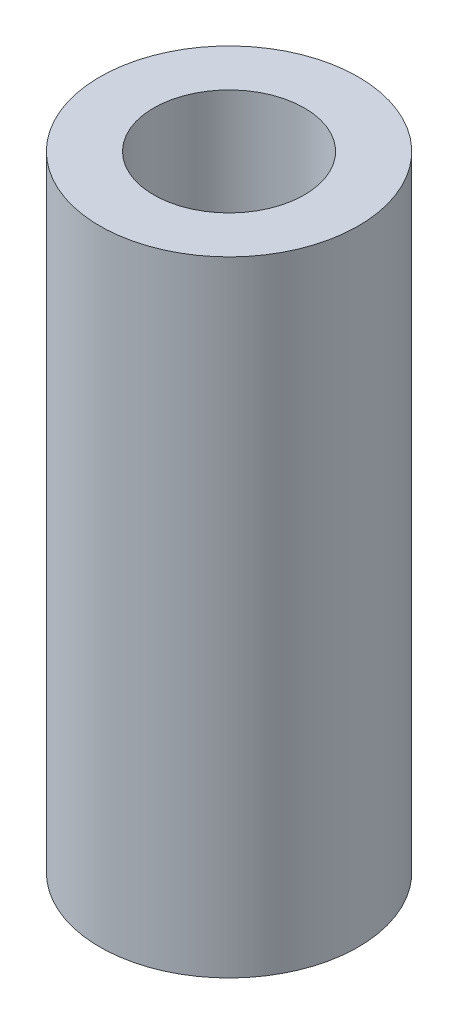
ISO-10303-21;
HEADER;
FILE_DESCRIPTION(('STEP AP214'),'2;1');
FILE_NAME('part.step','',(''),(''),'','','');
FILE_SCHEMA(('AUTOMOTIVE_DESIGN { 1 0 10303 214 1 1 1 1 }'));
ENDSEC;
DATA;
#1=APPLICATION_CONTEXT('core data for automotive mechanical design processes');
#2=APPLICATION_PROTOCOL_DEFINITION('international standard','automotive_design',2000,#1);
#3=PRODUCT_CONTEXT('',#1,'mechanical');
#4=PRODUCT('Part','Part','',(#3));
#5=PRODUCT_RELATED_PRODUCT_CATEGORY('part','',(#4));
#6=PRODUCT_DEFINITION_FORMATION('','',#4);
#7=PRODUCT_DEFINITION_CONTEXT('part definition',#1,'design');
#8=PRODUCT_DEFINITION('design','',#6,#7);
#9=PRODUCT_DEFINITION_SHAPE('','',#8);
#10=(LENGTH_UNIT() NAMED_UNIT(*) SI_UNIT(.MILLI.,.METRE.));
#11=(NAMED_UNIT(*) PLANE_ANGLE_UNIT() SI_UNIT($,.RADIAN.));
#12=(NAMED_UNIT(*) SI_UNIT($,.STERADIAN.) SOLID_ANGLE_UNIT());
#13=UNCERTAINTY_MEASURE_WITH_UNIT(LENGTH_MEASURE(1.E-05),#10,'distance_accuracy_value','');
#14=(GEOMETRIC_REPRESENTATION_CONTEXT(3) GLOBAL_UNCERTAINTY_ASSIGNED_CONTEXT((#13)) GLOBAL_UNIT_ASSIGNED_CONTEXT((#10,
#11,#12)) REPRESENTATION_CONTEXT('',''));
#15=CARTESIAN_POINT('',(0.,0.,0.));
#16=DIRECTION('',(0.,0.,1.));
#17=DIRECTION('',(1.,0.,0.));
#18=AXIS2_PLACEMENT_3D('',#15,#16,#17);
#19=CARTESIAN_POINT('',(0.,29.,0.));
#20=DIRECTION('',(0.,1.,0.));
#21=DIRECTION('',(0.,0.,1.));
#22=AXIS2_PLACEMENT_3D('',#19,#20,#21);
#23=PLANE('',#22);
#24=CARTESIAN_POINT('',(0.,29.,0.));
#25=DIRECTION('',(0.,1.,0.));
#26=DIRECTION('',(0.,0.,1.));
#27=AXIS2_PLACEMENT_3D('',#24,#25,#26);
#28=CIRCLE('',#27,6.);
#29=CARTESIAN_POINT('',(0.,29.,-6.));
#30=VERTEX_POINT('',#29);
#31=EDGE_CURVE('E10',#30,#30,#28,.T.);
#32=ORIENTED_EDGE('',*,*,#31,.T.);
#33=EDGE_LOOP('',(#32));
#34=FACE_BOUND('',#33,.T.);
#35=CARTESIAN_POINT('',(0.,29.,0.));
#36=DIRECTION('',(0.,1.,0.));
#37=DIRECTION('',(0.,0.,1.));
#38=AXIS2_PLACEMENT_3D('',#35,#36,#37);
#39=CIRCLE('',#38,3.5);
#40=CARTESIAN_POINT('',(0.,29.,-3.5));
#41=VERTEX_POINT('',#40);
#42=EDGE_CURVE('E41',#41,#41,#39,.T.);
#43=ORIENTED_EDGE('',*,*,#42,.F.);
#44=EDGE_LOOP('',(#43));
#45=FACE_BOUND('',#44,.T.);
#46=ADVANCED_FACE('F30',(#34,#45),#23,.T.);
#47=CARTESIAN_POINT('',(0.,0.,0.));
#48=DIRECTION('',(0.,1.,0.));
#49=DIRECTION('',(0.,0.,1.));
#50=AXIS2_PLACEMENT_3D('',#47,#48,#49);
#51=PLANE('',#50);
#52=CARTESIAN_POINT('',(0.,0.,0.));
#53=DIRECTION('',(0.,1.,0.));
#54=DIRECTION('',(0.,0.,1.));
#55=AXIS2_PLACEMENT_3D('',#52,#53,#54);
#56=CIRCLE('',#55,6.);
#57=CARTESIAN_POINT('',(0.,0.,-6.));
#58=VERTEX_POINT('',#57);
#59=EDGE_CURVE('E34',#58,#58,#56,.T.);
#60=ORIENTED_EDGE('',*,*,#59,.F.);
#61=EDGE_LOOP('',(#60));
#62=FACE_BOUND('',#61,.T.);
#63=CARTESIAN_POINT('',(0.,0.,0.));
#64=DIRECTION('',(0.,1.,0.));
#65=DIRECTION('',(0.,0.,1.));
#66=AXIS2_PLACEMENT_3D('',#63,#64,#65);
#67=CIRCLE('',#66,3.5);
#68=CARTESIAN_POINT('',(0.,0.,-3.5));
#69=VERTEX_POINT('',#68);
#70=EDGE_CURVE('E43',#69,#69,#67,.T.);
#71=ORIENTED_EDGE('',*,*,#70,.T.);
#72=EDGE_LOOP('',(#71));
#73=FACE_BOUND('',#72,.T.);
#74=ADVANCED_FACE('F53',(#62,#73),#51,.F.);
#75=CARTESIAN_POINT('',(0.,29.,0.));
#76=DIRECTION('',(0.,-1.,0.));
#77=DIRECTION('',(0.,0.,-1.));
#78=AXIS2_PLACEMENT_3D('',#75,#76,#77);
#79=CYLINDRICAL_SURFACE('',#78,6.);
#80=CARTESIAN_POINT('',(0.,29.,-6.));
#81=CARTESIAN_POINT('',(0.,28.6979166666667,-6.));
#82=CARTESIAN_POINT('',(0.,28.3958333333333,-6.));
#83=CARTESIAN_POINT('',(0.,27.7916666666667,-6.));
#84=CARTESIAN_POINT('',(0.,27.4895833333333,-6.));
#85=CARTESIAN_POINT('',(0.,26.8854166666667,-6.));
#86=CARTESIAN_POINT('',(0.,26.5833333333333,-6.));
#87=CARTESIAN_POINT('',(0.,25.9791666666667,-6.));
#88=CARTESIAN_POINT('',(0.,25.6770833333333,-6.));
#89=CARTESIAN_POINT('',(0.,25.0729166666667,-6.));
#90=CARTESIAN_POINT('',(0.,24.7708333333333,-6.));
#91=CARTESIAN_POINT('',(0.,24.1666666666667,-6.));
#92=CARTESIAN_POINT('',(0.,23.8645833333333,-6.));
#93=CARTESIAN_POINT('',(0.,23.2604166666667,-6.));
#94=CARTESIAN_POINT('',(0.,22.9583333333333,-6.));
#95=CARTESIAN_POINT('',(0.,22.3541666666667,-6.));
#96=CARTESIAN_POINT('',(0.,22.0520833333333,-6.));
#97=CARTESIAN_POINT('',(0.,21.4479166666667,-6.));
#98=CARTESIAN_POINT('',(0.,21.1458333333333,-6.));
#99=CARTESIAN_POINT('',(0.,20.5416666666667,-6.));
#100=CARTESIAN_POINT('',(0.,20.2395833333333,-6.));
#101=CARTESIAN_POINT('',(0.,19.6354166666667,-6.));
#102=CARTESIAN_POINT('',(0.,19.3333333333333,-6.));
#103=CARTESIAN_POINT('',(0.,18.7291666666667,-6.));
#104=CARTESIAN_POINT('',(0.,18.4270833333333,-6.));
#105=CARTESIAN_POINT('',(0.,17.8229166666667,-6.));
#106=CARTESIAN_POINT('',(0.,17.5208333333333,-6.));
#107=CARTESIAN_POINT('',(0.,16.9166666666667,-6.));
#108=CARTESIAN_POINT('',(0.,16.6145833333333,-6.));
#109=CARTESIAN_POINT('',(0.,16.0104166666667,-6.));
#110=CARTESIAN_POINT('',(0.,15.7083333333333,-6.));
#111=CARTESIAN_POINT('',(0.,15.1041666666667,-6.));
#112=CARTESIAN_POINT('',(0.,14.8020833333333,-6.));
#113=CARTESIAN_POINT('',(0.,14.1979166666667,-6.));
#114=CARTESIAN_POINT('',(0.,13.8958333333333,-6.));
#115=CARTESIAN_POINT('',(0.,13.2916666666667,-6.));
#116=CARTESIAN_POINT('',(0.,12.9895833333333,-6.));
#117=CARTESIAN_POINT('',(0.,12.3854166666667,-6.));
#118=CARTESIAN_POINT('',(0.,12.0833333333333,-6.));
#119=CARTESIAN_POINT('',(0.,11.4791666666667,-6.));
#120=CARTESIAN_POINT('',(0.,11.1770833333333,-6.));
#121=CARTESIAN_POINT('',(0.,10.5729166666667,-6.));
#122=CARTESIAN_POINT('',(0.,10.2708333333333,-6.));
#123=CARTESIAN_POINT('',(0.,9.66666666666667,-6.));
#124=CARTESIAN_POINT('',(0.,9.36458333333333,-6.));
#125=CARTESIAN_POINT('',(0.,8.76041666666667,-6.));
#126=CARTESIAN_POINT('',(0.,8.45833333333333,-6.));
#127=CARTESIAN_POINT('',(0.,7.85416666666667,-6.));
#128=CARTESIAN_POINT('',(0.,7.55208333333333,-6.));
#129=CARTESIAN_POINT('',(0.,6.94791666666667,-6.));
#130=CARTESIAN_POINT('',(0.,6.64583333333333,-6.));
#131=CARTESIAN_POINT('',(0.,6.04166666666667,-6.));
#132=CARTESIAN_POINT('',(0.,5.73958333333333,-6.));
#133=CARTESIAN_POINT('',(0.,5.13541666666667,-6.));
#134=CARTESIAN_POINT('',(0.,4.83333333333333,-6.));
#135=CARTESIAN_POINT('',(0.,4.22916666666667,-6.));
#136=CARTESIAN_POINT('',(0.,3.92708333333333,-6.));
#137=CARTESIAN_POINT('',(0.,3.32291666666667,-6.));
#138=CARTESIAN_POINT('',(0.,3.02083333333333,-6.));
#139=CARTESIAN_POINT('',(0.,2.41666666666667,-6.));
#140=CARTESIAN_POINT('',(0.,2.11458333333333,-6.));
#141=CARTESIAN_POINT('',(0.,1.51041666666667,-6.));
#142=CARTESIAN_POINT('',(0.,1.20833333333333,-6.));
#143=CARTESIAN_POINT('',(0.,0.604166666666667,-6.));
#144=CARTESIAN_POINT('',(0.,0.302083333333333,-6.));
#145=CARTESIAN_POINT('',(0.,0.,-6.));
#146=B_SPLINE_CURVE_WITH_KNOTS('',3,(#80,#81,#82,#83,#84,#85,#86,#87,#88,#89,#90,#91,#92,#93,
#94,#95,#96,#97,#98,#99,#100,#101,#102,#103,#104,#105,#106,#107,#108,#109,#110,#111,#112,#113,
#114,#115,#116,#117,#118,#119,#120,#121,#122,#123,#124,#125,#126,#127,#128,#129,#130,#131,#132,
#133,#134,#135,#136,#137,#138,#139,#140,#141,#142,#143,#144,#145),.UNSPECIFIED.,.F.,.F.,(4,2,2,
2,2,2,2,2,2,2,2,2,2,2,2,2,2,2,2,2,2,2,2,2,2,2,2,2,2,2,2,2,4),(0.,0.906250000000001,1.8125,
2.71875,3.625,4.53125,5.4375,6.34375,7.25,8.15625,9.0625,9.96875,10.875,11.78125,12.6875,
13.59375,14.5,15.40625,16.3125,17.21875,18.125,19.03125,19.9375,20.84375,21.75,22.65625,23.5625,
24.46875,25.375,26.28125,27.1875,28.09375,29.),.UNSPECIFIED.);
#147=EDGE_CURVE('BSEAM32',#30,#58,#146,.T.);
#148=ORIENTED_EDGE('',*,*,#31,.F.);
#149=ORIENTED_EDGE('',*,*,#59,.T.);
#150=ORIENTED_EDGE('',*,*,#147,.T.);
#151=ORIENTED_EDGE('',*,*,#147,.F.);
#152=EDGE_LOOP('',(#148,#150,#149,#151));
#153=FACE_BOUND('',#152,.T.);
#154=ADVANCED_FACE('F32',(#153),#79,.T.);
#155=CARTESIAN_POINT('',(0.,29.,0.));
#156=DIRECTION('',(0.,-1.,0.));
#157=DIRECTION('',(0.,0.,-1.));
#158=AXIS2_PLACEMENT_3D('',#155,#156,#157);
#159=CYLINDRICAL_SURFACE('',#158,3.5);
#160=CARTESIAN_POINT('',(0.,29.,-3.5));
#161=CARTESIAN_POINT('',(0.,28.6979166666667,-3.5));
#162=CARTESIAN_POINT('',(0.,28.3958333333333,-3.5));
#163=CARTESIAN_POINT('',(0.,27.7916666666667,-3.5));
#164=CARTESIAN_POINT('',(0.,27.4895833333333,-3.5));
#165=CARTESIAN_POINT('',(0.,26.8854166666667,-3.5));
#166=CARTESIAN_POINT('',(0.,26.5833333333333,-3.5));
#167=CARTESIAN_POINT('',(0.,25.9791666666667,-3.5));
#168=CARTESIAN_POINT('',(0.,25.6770833333333,-3.5));
#169=CARTESIAN_POINT('',(0.,25.0729166666667,-3.5));
#170=CARTESIAN_POINT('',(0.,24.7708333333333,-3.5));
#171=CARTESIAN_POINT('',(0.,24.1666666666667,-3.5));
#172=CARTESIAN_POINT('',(0.,23.8645833333333,-3.5));
#173=CARTESIAN_POINT('',(0.,23.2604166666667,-3.5));
#174=CARTESIAN_POINT('',(0.,22.9583333333333,-3.5));
#175=CARTESIAN_POINT('',(0.,22.3541666666667,-3.5));
#176=CARTESIAN_POINT('',(0.,22.0520833333333,-3.5));
#177=CARTESIAN_POINT('',(0.,21.4479166666667,-3.5));
#178=CARTESIAN_POINT('',(0.,21.1458333333333,-3.5));
#179=CARTESIAN_POINT('',(0.,20.5416666666667,-3.5));
#180=CARTESIAN_POINT('',(0.,20.2395833333333,-3.5));
#181=CARTESIAN_POINT('',(0.,19.6354166666667,-3.5));
#182=CARTESIAN_POINT('',(0.,19.3333333333333,-3.5));
#183=CARTESIAN_POINT('',(0.,18.7291666666667,-3.5));
#184=CARTESIAN_POINT('',(0.,18.4270833333333,-3.5));
#185=CARTESIAN_POINT('',(0.,17.8229166666667,-3.5));
#186=CARTESIAN_POINT('',(0.,17.5208333333333,-3.5));
#187=CARTESIAN_POINT('',(0.,16.9166666666667,-3.5));
#188=CARTESIAN_POINT('',(0.,16.6145833333333,-3.5));
#189=CARTESIAN_POINT('',(0.,16.0104166666667,-3.5));
#190=CARTESIAN_POINT('',(0.,15.7083333333333,-3.5));
#191=CARTESIAN_POINT('',(0.,15.1041666666667,-3.5));
#192=CARTESIAN_POINT('',(0.,14.8020833333333,-3.5));
#193=CARTESIAN_POINT('',(0.,14.1979166666667,-3.5));
#194=CARTESIAN_POINT('',(0.,13.8958333333333,-3.5));
#195=CARTESIAN_POINT('',(0.,13.2916666666667,-3.5));
#196=CARTESIAN_POINT('',(0.,12.9895833333333,-3.5));
#197=CARTESIAN_POINT('',(0.,12.3854166666667,-3.5));
#198=CARTESIAN_POINT('',(0.,12.0833333333333,-3.5));
#199=CARTESIAN_POINT('',(0.,11.4791666666667,-3.5));
#200=CARTESIAN_POINT('',(0.,11.1770833333333,-3.5));
#201=CARTESIAN_POINT('',(0.,10.5729166666667,-3.5));
#202=CARTESIAN_POINT('',(0.,10.2708333333333,-3.5));
#203=CARTESIAN_POINT('',(0.,9.66666666666667,-3.5));
#204=CARTESIAN_POINT('',(0.,9.36458333333333,-3.5));
#205=CARTESIAN_POINT('',(0.,8.76041666666667,-3.5));
#206=CARTESIAN_POINT('',(0.,8.45833333333333,-3.5));
#207=CARTESIAN_POINT('',(0.,7.85416666666667,-3.5));
#208=CARTESIAN_POINT('',(0.,7.55208333333333,-3.5));
#209=CARTESIAN_POINT('',(0.,6.94791666666667,-3.5));
#210=CARTESIAN_POINT('',(0.,6.64583333333333,-3.5));
#211=CARTESIAN_POINT('',(0.,6.04166666666667,-3.5));
#212=CARTESIAN_POINT('',(0.,5.73958333333333,-3.5));
#213=CARTESIAN_POINT('',(0.,5.13541666666667,-3.5));
#214=CARTESIAN_POINT('',(0.,4.83333333333333,-3.5));
#215=CARTESIAN_POINT('',(0.,4.22916666666667,-3.5));
#216=CARTESIAN_POINT('',(0.,3.92708333333333,-3.5));
#217=CARTESIAN_POINT('',(0.,3.32291666666667,-3.5));
#218=CARTESIAN_POINT('',(0.,3.02083333333333,-3.5));
#219=CARTESIAN_POINT('',(0.,2.41666666666667,-3.5));
#220=CARTESIAN_POINT('',(0.,2.11458333333333,-3.5));
#221=CARTESIAN_POINT('',(0.,1.51041666666667,-3.5));
#222=CARTESIAN_POINT('',(0.,1.20833333333333,-3.5));
#223=CARTESIAN_POINT('',(0.,0.604166666666667,-3.5));
#224=CARTESIAN_POINT('',(0.,0.302083333333333,-3.5));
#225=CARTESIAN_POINT('',(0.,0.,-3.5));
#226=B_SPLINE_CURVE_WITH_KNOTS('',3,(#160,#161,#162,#163,#164,#165,#166,#167,#168,#169,#170,
#171,#172,#173,#174,#175,#176,#177,#178,#179,#180,#181,#182,#183,#184,#185,#186,#187,#188,#189,
#190,#191,#192,#193,#194,#195,#196,#197,#198,#199,#200,#201,#202,#203,#204,#205,#206,#207,#208,
#209,#210,#211,#212,#213,#214,#215,#216,#217,#218,#219,#220,#221,#222,#223,#224,#225),
.UNSPECIFIED.,.F.,.F.,(4,2,2,2,2,2,2,2,2,2,2,2,2,2,2,2,2,2,2,2,2,2,2,2,2,2,2,2,2,2,2,2,4),(0.,
0.906250000000001,1.8125,2.71875,3.625,4.53125,5.4375,6.34375,7.25,8.15625,9.0625,9.96875,
10.875,11.78125,12.6875,13.59375,14.5,15.40625,16.3125,17.21875,18.125,19.03125,19.9375,
20.84375,21.75,22.65625,23.5625,24.46875,25.375,26.28125,27.1875,28.09375,29.),.UNSPECIFIED.);
#227=EDGE_CURVE('BSEAM49',#41,#69,#226,.T.);
#228=ORIENTED_EDGE('',*,*,#42,.T.);
#229=ORIENTED_EDGE('',*,*,#70,.F.);
#230=ORIENTED_EDGE('',*,*,#227,.T.);
#231=ORIENTED_EDGE('',*,*,#227,.F.);
#232=EDGE_LOOP('',(#228,#230,#229,#231));
#233=FACE_BOUND('',#232,.T.);
#234=ADVANCED_FACE('F49',(#233),#159,.F.);
#235=CLOSED_SHELL('',(#46,#74,#154,#234));
#236=MANIFOLD_SOLID_BREP('B2',#235);
#237=ADVANCED_BREP_SHAPE_REPRESENTATION('',(#18,#236),#14);
#238=SHAPE_DEFINITION_REPRESENTATION(#9,#237);
ENDSEC;
END-ISO-10303-21;
